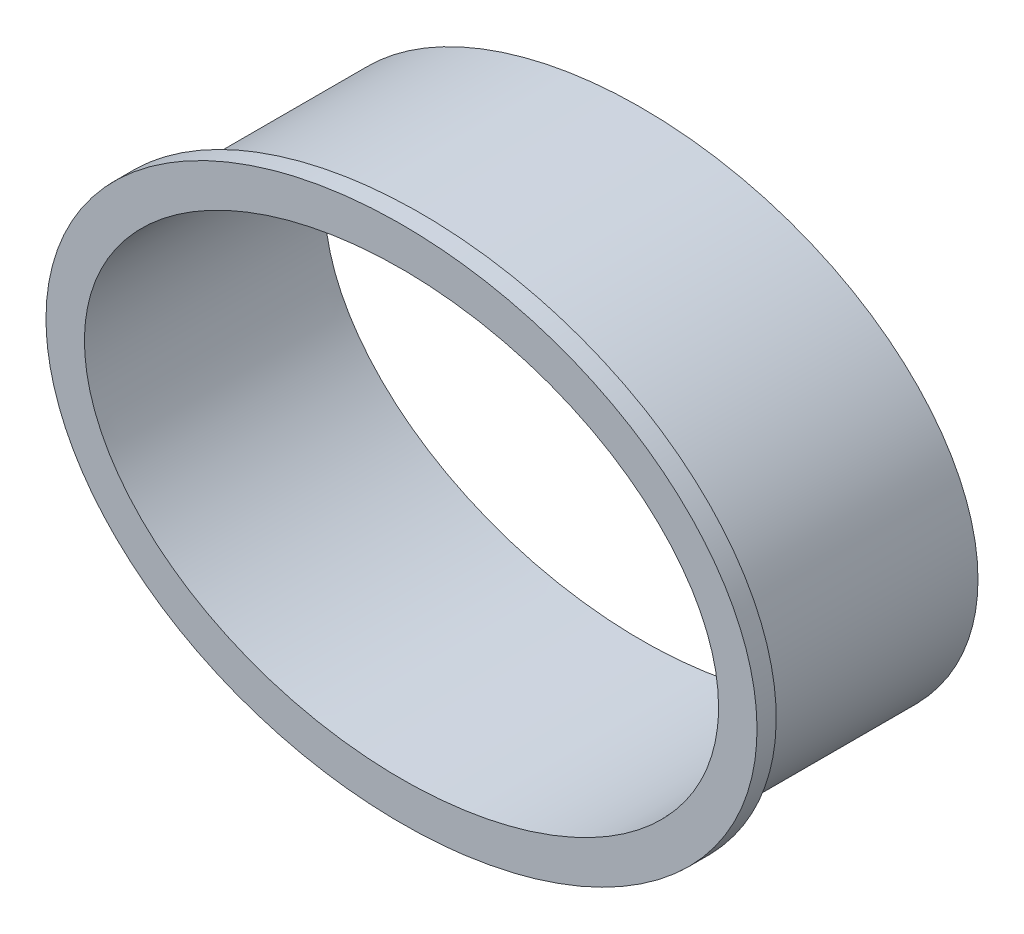
ISO-10303-21;
HEADER;
FILE_DESCRIPTION(('STEP AP214'),'2;1');
FILE_NAME('part.step','',(''),(''),'','','');
FILE_SCHEMA(('AUTOMOTIVE_DESIGN { 1 0 10303 214 1 1 1 1 }'));
ENDSEC;
DATA;
#1=APPLICATION_CONTEXT('core data for automotive mechanical design processes');
#2=APPLICATION_PROTOCOL_DEFINITION('international standard','automotive_design',2000,#1);
#3=PRODUCT_CONTEXT('',#1,'mechanical');
#4=PRODUCT('Part','Part','',(#3));
#5=PRODUCT_RELATED_PRODUCT_CATEGORY('part','',(#4));
#6=PRODUCT_DEFINITION_FORMATION('','',#4);
#7=PRODUCT_DEFINITION_CONTEXT('part definition',#1,'design');
#8=PRODUCT_DEFINITION('design','',#6,#7);
#9=PRODUCT_DEFINITION_SHAPE('','',#8);
#10=(LENGTH_UNIT() NAMED_UNIT(*) SI_UNIT(.MILLI.,.METRE.));
#11=(NAMED_UNIT(*) PLANE_ANGLE_UNIT() SI_UNIT($,.RADIAN.));
#12=(NAMED_UNIT(*) SI_UNIT($,.STERADIAN.) SOLID_ANGLE_UNIT());
#13=UNCERTAINTY_MEASURE_WITH_UNIT(LENGTH_MEASURE(1.E-05),#10,'distance_accuracy_value','');
#14=(GEOMETRIC_REPRESENTATION_CONTEXT(3) GLOBAL_UNCERTAINTY_ASSIGNED_CONTEXT((#13)) GLOBAL_UNIT_ASSIGNED_CONTEXT((#10,
#11,#12)) REPRESENTATION_CONTEXT('',''));
#15=CARTESIAN_POINT('',(0.,0.,0.));
#16=DIRECTION('',(0.,0.,1.));
#17=DIRECTION('',(1.,0.,0.));
#18=AXIS2_PLACEMENT_3D('',#15,#16,#17);
#19=CARTESIAN_POINT('',(0.,0.,25.));
#20=DIRECTION('',(0.,0.,1.));
#21=DIRECTION('',(1.,0.,0.));
#22=AXIS2_PLACEMENT_3D('',#19,#20,#21);
#23=PLANE('',#22);
#24=CARTESIAN_POINT('',(33.,0.,25.));
#25=CARTESIAN_POINT('',(33.,2.91062285011088,25.));
#26=CARTESIAN_POINT('',(31.3999346104749,8.73186855033263,25.));
#27=CARTESIAN_POINT('',(24.2341013569489,16.4552082352201,25.));
#28=CARTESIAN_POINT('',(13.1812256862753,21.7485140322884,25.));
#29=CARTESIAN_POINT('',(0.,23.6257429838558,25.));
#30=CARTESIAN_POINT('',(-13.1812256862753,21.7485140322884,25.));
#31=CARTESIAN_POINT('',(-24.2341013569489,16.4552082352201,25.));
#32=CARTESIAN_POINT('',(-31.3999346104749,8.73186855033263,25.));
#33=CARTESIAN_POINT('',(-33.8000326947625,0.,25.));
#34=CARTESIAN_POINT('',(-31.3999346104749,-8.73186855033263,25.));
#35=CARTESIAN_POINT('',(-24.2341013569489,-16.4552082352201,25.));
#36=CARTESIAN_POINT('',(-13.1812256862753,-21.7485140322884,25.));
#37=CARTESIAN_POINT('',(0.,-23.6257429838558,25.));
#38=CARTESIAN_POINT('',(13.1812256862753,-21.7485140322884,25.));
#39=CARTESIAN_POINT('',(24.2341013569489,-16.4552082352201,25.));
#40=CARTESIAN_POINT('',(31.3999346104749,-8.73186855033264,25.));
#41=CARTESIAN_POINT('',(33.,-2.91062285011089,25.));
#42=CARTESIAN_POINT('',(33.,0.,25.));
#43=B_SPLINE_CURVE_WITH_KNOTS('',3,(#24,#25,#26,#27,#28,#29,#30,#31,#32,#33,#34,#35,#36,#37,#38,
#39,#40,#41,#42),.UNSPECIFIED.,.T.,.F.,(4,1,1,1,1,1,1,1,1,1,1,1,1,1,1,1,4),(0.,
0.392699081698724,0.785398163397448,1.17809724509617,1.5707963267949,1.96349540849362,
2.35619449019234,2.74889357189107,3.14159265358979,3.53429173528852,3.92699081698724,
4.31968989868597,4.71238898038469,5.10508806208341,5.49778714378214,5.89048622548086,
6.28318530717959),.UNSPECIFIED.);
#44=CARTESIAN_POINT('',(33.,0.,25.));
#45=VERTEX_POINT('',#44);
#46=EDGE_CURVE('E53',#45,#45,#43,.T.);
#47=ORIENTED_EDGE('',*,*,#46,.F.);
#48=EDGE_LOOP('',(#47));
#49=FACE_BOUND('',#48,.T.);
#50=CARTESIAN_POINT('',(-37.,0.,25.));
#51=CARTESIAN_POINT('',(-37.,0.534208004363688,25.));
#52=CARTESIAN_POINT('',(-36.978371825077,1.06636015323966,25.));
#53=CARTESIAN_POINT('',(-36.8937045085019,2.1198034820875,25.));
#54=CARTESIAN_POINT('',(-36.830662237015,2.64228191741466,25.));
#55=CARTESIAN_POINT('',(-36.5813648184813,4.19738816709892,25.));
#56=CARTESIAN_POINT('',(-36.33514054876,5.21772820903059,25.));
#57=CARTESIAN_POINT('',(-35.8495344658534,6.72441442252837,25.));
#58=CARTESIAN_POINT('',(-35.6682351806495,7.22266180014688,25.));
#59=CARTESIAN_POINT('',(-35.2668055863474,8.21120001436105,25.));
#60=CARTESIAN_POINT('',(-35.0477618515882,8.6984745586051,25.));
#61=CARTESIAN_POINT('',(-34.3454920481498,10.1254235572445,25.));
#62=CARTESIAN_POINT('',(-33.8147414500529,11.0368238760066,25.));
#63=CARTESIAN_POINT('',(-32.6406883150867,12.7878543519093,25.));
#64=CARTESIAN_POINT('',(-31.9973183861515,13.6274415356501,25.));
#65=CARTESIAN_POINT('',(-30.9531678376952,14.8363859704157,25.));
#66=CARTESIAN_POINT('',(-30.5926850532799,15.2298901525875,25.));
#67=CARTESIAN_POINT('',(-29.8550679142658,15.9917612478385,25.));
#68=CARTESIAN_POINT('',(-29.4769670720748,16.361263564484,25.));
#69=CARTESIAN_POINT('',(-27.5428824785897,18.1551537574857,25.));
#70=CARTESIAN_POINT('',(-25.8578096003217,19.4207101126512,25.));
#71=CARTESIAN_POINT('',(-23.6055525311538,20.8231202523102,25.));
#72=CARTESIAN_POINT('',(-23.1467826427296,21.0949863274686,25.));
#73=CARTESIAN_POINT('',(-22.2235582487253,21.6161641401544,25.));
#74=CARTESIAN_POINT('',(-21.7582775310569,21.8660435287032,25.));
#75=CARTESIAN_POINT('',(-20.3520584708168,22.5853883737476,25.));
#76=CARTESIAN_POINT('',(-19.4007738835733,23.0246500229064,25.));
#77=CARTESIAN_POINT('',(-16.5091893569529,24.2322874927662,25.));
#78=CARTESIAN_POINT('',(-14.5314578152725,24.8913891816313,25.));
#79=CARTESIAN_POINT('',(-11.497260877939,25.6826980304667,25.));
#80=CARTESIAN_POINT('',(-10.4745111046607,25.9133312565843,25.));
#81=CARTESIAN_POINT('',(-8.92362830604622,26.2103590367354,25.));
#82=CARTESIAN_POINT('',(-8.40387026703986,26.3012027007191,25.));
#83=CARTESIAN_POINT('',(-7.35875647551432,26.4665486153687,25.));
#84=CARTESIAN_POINT('',(-6.83311347703773,26.5410525007404,25.));
#85=CARTESIAN_POINT('',(-4.20965990881901,26.870438629738,25.));
#86=CARTESIAN_POINT('',(-2.11141620402273,26.9994359638324,25.));
#87=CARTESIAN_POINT('',(2.0840798102645,27.000560373038,25.));
#88=CARTESIAN_POINT('',(4.18133209491143,26.8726810110651,25.));
#89=CARTESIAN_POINT('',(7.32643435322626,26.4797568766075,25.));
#90=CARTESIAN_POINT('',(8.37651933202895,26.314511520363,25.));
#91=CARTESIAN_POINT('',(10.4493276787632,25.9187685941595,25.));
#92=CARTESIAN_POINT('',(11.4751891448462,25.6880110853729,25.));
#93=CARTESIAN_POINT('',(14.5205160476986,24.8951172063839,25.));
#94=CARTESIAN_POINT('',(16.5080569352589,24.2333980482441,25.));
#95=CARTESIAN_POINT('',(19.4176989395047,23.0172599631808,25.));
#96=CARTESIAN_POINT('',(20.3755614895983,22.5743922821687,25.));
#97=CARTESIAN_POINT('',(22.2647550702488,21.6058967011547,25.));
#98=CARTESIAN_POINT('',(23.187751551996,21.0842828916985,25.));
#99=CARTESIAN_POINT('',(25.8688859190187,19.4117473919819,25.));
#100=CARTESIAN_POINT('',(27.5485766682968,18.15084567168,25.));
#101=CARTESIAN_POINT('',(29.8721903588667,15.9941982829925,25.));
#102=CARTESIAN_POINT('',(30.6172036991141,15.2261281177606,25.));
#103=CARTESIAN_POINT('',(32.001984412415,13.6212757110772,25.));
#104=CARTESIAN_POINT('',(32.6445885415018,12.782732843373,25.));
#105=CARTESIAN_POINT('',(33.5269194667773,11.4657409995195,25.));
#106=CARTESIAN_POINT('',(33.8073983535203,11.0168550099361,25.));
#107=CARTESIAN_POINT('',(34.3394175981567,10.0980900135283,25.));
#108=CARTESIAN_POINT('',(34.5917274831001,9.62652730716563,25.));
#109=CARTESIAN_POINT('',(35.2943178631577,8.19451575631891,25.));
#110=CARTESIAN_POINT('',(35.691789399553,7.21566926396877,25.));
#111=CARTESIAN_POINT('',(36.1763889638387,5.70936063272713,25.));
#112=CARTESIAN_POINT('',(36.3192745457134,5.20090215440884,25.));
#113=CARTESIAN_POINT('',(36.5662365511963,4.17075800220632,25.));
#114=CARTESIAN_POINT('',(36.6705531645955,3.6475110084645,25.));
#115=CARTESIAN_POINT('',(36.920614651694,2.06744768511321,25.));
#116=CARTESIAN_POINT('',(37.0018536611945,1.01530848301199,25.));
#117=CARTESIAN_POINT('',(36.9980824134517,-1.0865650422981,25.));
#118=CARTESIAN_POINT('',(36.9130643945453,-2.13629925323065,25.));
#119=CARTESIAN_POINT('',(36.6589797662201,-3.70906985057264,25.));
#120=CARTESIAN_POINT('',(36.5526157774389,-4.23443865281458,25.));
#121=CARTESIAN_POINT('',(36.3017948631361,-5.26603570853028,25.));
#122=CARTESIAN_POINT('',(36.1571096973246,-5.77442898087401,25.));
#123=CARTESIAN_POINT('',(35.6679479974542,-7.27843724524308,25.));
#124=CARTESIAN_POINT('',(35.2685557634005,-8.2529538747786,25.));
#125=CARTESIAN_POINT('',(34.3322399880069,-10.1491482303105,25.));
#126=CARTESIAN_POINT('',(33.791271403953,-11.0754506114809,25.));
#127=CARTESIAN_POINT('',(32.0193192254213,-13.7070887545725,25.));
#128=CARTESIAN_POINT('',(30.6335153149815,-15.2900925966419,25.));
#129=CARTESIAN_POINT('',(28.6894518415622,-17.0913015442211,25.));
#130=CARTESIAN_POINT('',(28.2888907924727,-17.4433041505494,25.));
#131=CARTESIAN_POINT('',(27.4748710724303,-18.123211898336,25.));
#132=CARTESIAN_POINT('',(27.0608075070507,-18.4517692501558,25.));
#133=CARTESIAN_POINT('',(25.7987689899553,-19.4053736024503,25.));
#134=CARTESIAN_POINT('',(24.9310116657235,-19.9984586434173,25.));
#135=CARTESIAN_POINT('',(23.1477597753376,-21.1075006765235,25.));
#136=CARTESIAN_POINT('',(22.2322434834826,-21.6234225669087,25.));
#137=CARTESIAN_POINT('',(20.8255252288674,-22.3432709372811,25.));
#138=CARTESIAN_POINT('',(20.351032648151,-22.5741944112767,25.));
#139=CARTESIAN_POINT('',(19.3911387314574,-23.018416314868,25.));
#140=CARTESIAN_POINT('',(18.9047295155853,-23.2321244516239,25.));
#141=CARTESIAN_POINT('',(16.4593603784222,-24.2518353745391,25.));
#142=CARTESIAN_POINT('',(14.4679275851152,-24.9108815339509,25.));
#143=CARTESIAN_POINT('',(10.42462792916,-25.9594217324227,25.));
#144=CARTESIAN_POINT('',(8.37265859965154,-26.3484587418681,25.));
#145=CARTESIAN_POINT('',(5.25149241428167,-26.7392763208798,25.));
#146=CARTESIAN_POINT('',(4.20385839977855,-26.8372329327392,25.));
#147=CARTESIAN_POINT('',(2.09398093474011,-26.9679841625274,25.));
#148=CARTESIAN_POINT('',(1.03426736361752,-27.000395928132,25.));
#149=CARTESIAN_POINT('',(-2.1265620828558,-26.9991971398987,25.));
#150=CARTESIAN_POINT('',(-4.22189821021005,-26.8687653587702,25.));
#151=CARTESIAN_POINT('',(-7.34688877559995,-26.4766139452693,25.));
#152=CARTESIAN_POINT('',(-8.38553407117109,-26.312972133706,25.));
#153=CARTESIAN_POINT('',(-10.4565469304869,-25.9172071388374,25.));
#154=CARTESIAN_POINT('',(-11.4923673832261,-25.6841211571052,25.));
#155=CARTESIAN_POINT('',(-14.5595875440856,-24.8837578788096,25.));
#156=CARTESIAN_POINT('',(-16.5500042550187,-24.2178177782963,25.));
#157=CARTESIAN_POINT('',(-20.4130238507727,-22.5992589863123,25.));
#158=CARTESIAN_POINT('',(-22.2859283175432,-21.6473741398514,25.));
#159=CARTESIAN_POINT('',(-25.8897849441895,-19.3981892383195,25.));
#160=CARTESIAN_POINT('',(-27.5725307891046,-18.1303766451533,25.));
#161=CARTESIAN_POINT('',(-29.8807472770785,-15.9853624971174,25.));
#162=CARTESIAN_POINT('',(-30.6143452730733,-15.2292301339677,25.));
#163=CARTESIAN_POINT('',(-31.653741168284,-14.0249671707285,25.));
#164=CARTESIAN_POINT('',(-31.9907358273889,-13.6107525762248,25.));
#165=CARTESIAN_POINT('',(-32.6351602031332,-12.7671876840169,25.));
#166=CARTESIAN_POINT('',(-32.9434330027451,-12.3369745304779,25.));
#167=CARTESIAN_POINT('',(-33.8250113983239,-11.0201830027722,25.));
#168=CARTESIAN_POINT('',(-34.3552764087928,-10.1075731717444,25.));
#169=CARTESIAN_POINT('',(-35.0557320144158,-8.68123643133327,25.));
#170=CARTESIAN_POINT('',(-35.2739351013321,-8.19471348913341,25.));
#171=CARTESIAN_POINT('',(-35.673750679779,-7.20797505965257,25.));
#172=CARTESIAN_POINT('',(-35.85431647569,-6.71065450515272,25.));
#173=CARTESIAN_POINT('',(-36.6603643230805,-4.20428049556793,25.));
#174=CARTESIAN_POINT('',(-37.,-2.13683201745475,25.));
#175=CARTESIAN_POINT('',(-37.,0.,25.));
#176=B_SPLINE_CURVE_WITH_KNOTS('',3,(#50,#51,#52,#53,#54,#55,#56,#57,#58,#59,#60,#61,#62,#63,
#64,#65,#66,#67,#68,#69,#70,#71,#72,#73,#74,#75,#76,#77,#78,#79,#80,#81,#82,#83,#84,#85,#86,#87,
#88,#89,#90,#91,#92,#93,#94,#95,#96,#97,#98,#99,#100,#101,#102,#103,#104,#105,#106,#107,#108,
#109,#110,#111,#112,#113,#114,#115,#116,#117,#118,#119,#120,#121,#122,#123,#124,#125,#126,#127,
#128,#129,#130,#131,#132,#133,#134,#135,#136,#137,#138,#139,#140,#141,#142,#143,#144,#145,#146,
#147,#148,#149,#150,#151,#152,#153,#154,#155,#156,#157,#158,#159,#160,#161,#162,#163,#164,#165,
#166,#167,#168,#169,#170,#171,#172,#173,#174,#175),.UNSPECIFIED.,.T.,.F.,(4,2,2,2,2,2,2,2,2,2,2,
2,2,2,2,2,2,2,2,2,2,2,2,2,2,2,2,2,2,2,2,2,2,2,2,2,2,2,2,2,2,2,2,2,2,2,2,2,2,2,2,2,2,2,2,2,2,2,2,
2,2,2,4),(0.,0.00781249999999989,0.0156249999999998,0.0312499999999998,0.0390624999999997,
0.0468749999999997,0.0624999999999996,0.0781249999999994,0.0859374999999994,0.0937499999999994,
0.124999999999999,0.132812499999999,0.140624999999999,0.156249999999999,0.187499999999999,
0.203124999999999,0.210937499999999,0.218749999999999,0.249999999999999,0.281249999999999,
0.296874999999999,0.312499999999999,0.343749999999999,0.359374999999999,0.374999999999999,
0.406249999999999,0.421874999999999,0.437499999999999,0.445312499999999,0.453124999999999,
0.468749999999999,0.476562499999999,0.484374999999999,0.499999999999999,0.515624999999999,
0.523437499999999,0.531249999999999,0.546874999999999,0.562499999999999,0.593749999999999,
0.601562499999999,0.609374999999999,0.624999999999999,0.640624999999999,0.648437499999999,
0.656249999999999,0.687499999999999,0.718749999999999,0.734374999999999,0.749999999999999,
0.78125,0.796875,0.8125,0.84375,0.875,0.90625,0.921875,0.9296875,0.9375,0.953125,0.9609375,
0.96875,1.),.UNSPECIFIED.);
#177=CARTESIAN_POINT('',(-37.,0.,25.));
#178=VERTEX_POINT('',#177);
#179=EDGE_CURVE('E66',#178,#178,#176,.F.);
#180=ORIENTED_EDGE('',*,*,#179,.T.);
#181=EDGE_LOOP('',(#180));
#182=FACE_BOUND('',#181,.T.);
#183=ADVANCED_FACE('F41',(#49,#182),#23,.T.);
#184=CARTESIAN_POINT('',(0.,0.,0.));
#185=DIRECTION('',(0.,0.,1.));
#186=DIRECTION('',(1.,0.,0.));
#187=AXIS2_PLACEMENT_3D('',#184,#185,#186);
#188=PLANE('',#187);
#189=CARTESIAN_POINT('',(0.,0.,0.));
#190=DIRECTION('',(0.,0.,1.));
#191=DIRECTION('',(1.,0.,0.));
#192=AXIS2_PLACEMENT_3D('',#189,#190,#191);
#193=ELLIPSE('',#192,35.,25.);
#194=CARTESIAN_POINT('',(35.,0.,0.));
#195=VERTEX_POINT('',#194);
#196=EDGE_CURVE('E10',#195,#195,#193,.T.);
#197=ORIENTED_EDGE('',*,*,#196,.F.);
#198=EDGE_LOOP('',(#197));
#199=FACE_BOUND('',#198,.T.);
#200=CARTESIAN_POINT('',(33.,0.,0.));
#201=CARTESIAN_POINT('',(33.,2.91062285011088,0.));
#202=CARTESIAN_POINT('',(31.3999346104749,8.73186855033263,0.));
#203=CARTESIAN_POINT('',(24.2341013569489,16.4552082352201,0.));
#204=CARTESIAN_POINT('',(13.1812256862753,21.7485140322884,0.));
#205=CARTESIAN_POINT('',(0.,23.6257429838558,0.));
#206=CARTESIAN_POINT('',(-13.1812256862753,21.7485140322884,0.));
#207=CARTESIAN_POINT('',(-24.2341013569489,16.4552082352201,0.));
#208=CARTESIAN_POINT('',(-31.3999346104749,8.73186855033263,0.));
#209=CARTESIAN_POINT('',(-33.8000326947625,0.,0.));
#210=CARTESIAN_POINT('',(-31.3999346104749,-8.73186855033263,0.));
#211=CARTESIAN_POINT('',(-24.2341013569489,-16.4552082352201,0.));
#212=CARTESIAN_POINT('',(-13.1812256862753,-21.7485140322884,0.));
#213=CARTESIAN_POINT('',(0.,-23.6257429838558,0.));
#214=CARTESIAN_POINT('',(13.1812256862753,-21.7485140322884,0.));
#215=CARTESIAN_POINT('',(24.2341013569489,-16.4552082352201,0.));
#216=CARTESIAN_POINT('',(31.3999346104749,-8.73186855033264,0.));
#217=CARTESIAN_POINT('',(33.,-2.91062285011089,0.));
#218=CARTESIAN_POINT('',(33.,0.,0.));
#219=B_SPLINE_CURVE_WITH_KNOTS('',3,(#200,#201,#202,#203,#204,#205,#206,#207,#208,#209,#210,
#211,#212,#213,#214,#215,#216,#217,#218),.UNSPECIFIED.,.T.,.F.,(4,1,1,1,1,1,1,1,1,1,1,1,1,1,1,1,
4),(0.,0.392699081698724,0.785398163397448,1.17809724509617,1.5707963267949,1.96349540849362,
2.35619449019234,2.74889357189107,3.14159265358979,3.53429173528852,3.92699081698724,
4.31968989868597,4.71238898038469,5.10508806208341,5.49778714378214,5.89048622548086,
6.28318530717959),.UNSPECIFIED.);
#220=CARTESIAN_POINT('',(33.,0.,0.));
#221=VERTEX_POINT('',#220);
#222=EDGE_CURVE('E59',#221,#221,#219,.T.);
#223=ORIENTED_EDGE('',*,*,#222,.T.);
#224=EDGE_LOOP('',(#223));
#225=FACE_BOUND('',#224,.T.);
#226=ADVANCED_FACE('F107',(#199,#225),#188,.F.);
#227=CARTESIAN_POINT('',(0.,0.,25.));
#228=DIRECTION('',(0.,0.,1.));
#229=DIRECTION('',(1.,0.,0.));
#230=AXIS2_PLACEMENT_3D('',#227,#228,#229);
#231=ELLIPSE('',#230,35.,25.);
#232=DIRECTION('',(0.,0.,-1.));
#233=VECTOR('',#232,1.);
#234=SURFACE_OF_LINEAR_EXTRUSION('',#231,#233);
#235=CARTESIAN_POINT('',(0.,0.,23.));
#236=DIRECTION('',(0.,0.,1.));
#237=DIRECTION('',(1.,0.,0.));
#238=AXIS2_PLACEMENT_3D('',#235,#236,#237);
#239=ELLIPSE('',#238,35.,25.);
#240=CARTESIAN_POINT('',(35.,0.,23.));
#241=VERTEX_POINT('',#240);
#242=EDGE_CURVE('E73',#241,#241,#239,.F.);
#243=ORIENTED_EDGE('',*,*,#242,.T.);
#244=EDGE_LOOP('',(#243));
#245=FACE_BOUND('',#244,.T.);
#246=ORIENTED_EDGE('',*,*,#196,.T.);
#247=EDGE_LOOP('',(#246));
#248=FACE_BOUND('',#247,.T.);
#249=ADVANCED_FACE('F43',(#245,#248),#234,.F.);
#250=DIRECTION('',(0.,0.,-1.));
#251=VECTOR('',#250,1.);
#252=SURFACE_OF_LINEAR_EXTRUSION('',#43,#251);
#253=ORIENTED_EDGE('',*,*,#222,.F.);
#254=EDGE_LOOP('',(#253));
#255=FACE_BOUND('',#254,.T.);
#256=ORIENTED_EDGE('',*,*,#46,.T.);
#257=EDGE_LOOP('',(#256));
#258=FACE_BOUND('',#257,.T.);
#259=ADVANCED_FACE('F97',(#255,#258),#252,.T.);
#260=CARTESIAN_POINT('',(36.9999680373231,-0.0356282796432738,23.));
#261=DIRECTION('',(0.,0.,-1.));
#262=DIRECTION('',(-1.,0.,0.));
#263=AXIS2_PLACEMENT_3D('',#260,#261,#262);
#264=PLANE('',#263);
#265=CARTESIAN_POINT('',(-37.,0.,23.));
#266=CARTESIAN_POINT('',(-37.,-2.13683201745475,23.));
#267=CARTESIAN_POINT('',(-36.6603643230805,-4.20428049556793,23.));
#268=CARTESIAN_POINT('',(-35.85431647569,-6.71065450515272,23.));
#269=CARTESIAN_POINT('',(-35.673750679779,-7.20797505965257,23.));
#270=CARTESIAN_POINT('',(-35.2739351013321,-8.19471348913341,23.));
#271=CARTESIAN_POINT('',(-35.0557320144158,-8.68123643133327,23.));
#272=CARTESIAN_POINT('',(-34.3552764087928,-10.1075731717444,23.));
#273=CARTESIAN_POINT('',(-33.8250113983239,-11.0201830027722,23.));
#274=CARTESIAN_POINT('',(-32.9434330027451,-12.3369745304779,23.));
#275=CARTESIAN_POINT('',(-32.6351602031332,-12.7671876840169,23.));
#276=CARTESIAN_POINT('',(-31.9907358273889,-13.6107525762248,23.));
#277=CARTESIAN_POINT('',(-31.653741168284,-14.0249671707285,23.));
#278=CARTESIAN_POINT('',(-30.6143452730733,-15.2292301339677,23.));
#279=CARTESIAN_POINT('',(-29.8807472770785,-15.9853624971174,23.));
#280=CARTESIAN_POINT('',(-27.5725307891046,-18.1303766451533,23.));
#281=CARTESIAN_POINT('',(-25.8897849441895,-19.3981892383195,23.));
#282=CARTESIAN_POINT('',(-22.2859283175432,-21.6473741398514,23.));
#283=CARTESIAN_POINT('',(-20.4130238507727,-22.5992589863123,23.));
#284=CARTESIAN_POINT('',(-16.5500042550187,-24.2178177782963,23.));
#285=CARTESIAN_POINT('',(-14.5595875440856,-24.8837578788096,23.));
#286=CARTESIAN_POINT('',(-11.4923673832261,-25.6841211571052,23.));
#287=CARTESIAN_POINT('',(-10.4565469304869,-25.9172071388374,23.));
#288=CARTESIAN_POINT('',(-8.38553407117109,-26.312972133706,23.));
#289=CARTESIAN_POINT('',(-7.34688877559995,-26.4766139452693,23.));
#290=CARTESIAN_POINT('',(-4.22189821021005,-26.8687653587702,23.));
#291=CARTESIAN_POINT('',(-2.1265620828558,-26.9991971398987,23.));
#292=CARTESIAN_POINT('',(1.03426736361752,-27.000395928132,23.));
#293=CARTESIAN_POINT('',(2.09398093474011,-26.9679841625274,23.));
#294=CARTESIAN_POINT('',(4.20385839977855,-26.8372329327392,23.));
#295=CARTESIAN_POINT('',(5.25149241428167,-26.7392763208798,23.));
#296=CARTESIAN_POINT('',(8.37265859965154,-26.3484587418681,23.));
#297=CARTESIAN_POINT('',(10.42462792916,-25.9594217324227,23.));
#298=CARTESIAN_POINT('',(14.4679275851152,-24.9108815339509,23.));
#299=CARTESIAN_POINT('',(16.4593603784222,-24.2518353745391,23.));
#300=CARTESIAN_POINT('',(18.9047295155853,-23.2321244516239,23.));
#301=CARTESIAN_POINT('',(19.3911387314574,-23.018416314868,23.));
#302=CARTESIAN_POINT('',(20.351032648151,-22.5741944112767,23.));
#303=CARTESIAN_POINT('',(20.8255252288674,-22.3432709372811,23.));
#304=CARTESIAN_POINT('',(22.2322434834826,-21.6234225669087,23.));
#305=CARTESIAN_POINT('',(23.1477597753376,-21.1075006765235,23.));
#306=CARTESIAN_POINT('',(24.9310116657235,-19.9984586434173,23.));
#307=CARTESIAN_POINT('',(25.7987689899553,-19.4053736024503,23.));
#308=CARTESIAN_POINT('',(27.0608075070507,-18.4517692501558,23.));
#309=CARTESIAN_POINT('',(27.4748710724303,-18.123211898336,23.));
#310=CARTESIAN_POINT('',(28.2888907924727,-17.4433041505494,23.));
#311=CARTESIAN_POINT('',(28.6894518415622,-17.0913015442211,23.));
#312=CARTESIAN_POINT('',(30.6335153149815,-15.2900925966419,23.));
#313=CARTESIAN_POINT('',(32.0193192254213,-13.7070887545725,23.));
#314=CARTESIAN_POINT('',(33.791271403953,-11.0754506114809,23.));
#315=CARTESIAN_POINT('',(34.3322399880069,-10.1491482303105,23.));
#316=CARTESIAN_POINT('',(35.2685557634005,-8.2529538747786,23.));
#317=CARTESIAN_POINT('',(35.6679479974542,-7.27843724524308,23.));
#318=CARTESIAN_POINT('',(36.1571096973246,-5.77442898087401,23.));
#319=CARTESIAN_POINT('',(36.3017948631361,-5.26603570853028,23.));
#320=CARTESIAN_POINT('',(36.5526157774389,-4.23443865281458,23.));
#321=CARTESIAN_POINT('',(36.6589797662201,-3.70906985057264,23.));
#322=CARTESIAN_POINT('',(36.9130643945453,-2.13629925323065,23.));
#323=CARTESIAN_POINT('',(36.9980824134517,-1.0865650422981,23.));
#324=CARTESIAN_POINT('',(37.0018536611945,1.01530848301199,23.));
#325=CARTESIAN_POINT('',(36.920614651694,2.06744768511321,23.));
#326=CARTESIAN_POINT('',(36.6705531645955,3.6475110084645,23.));
#327=CARTESIAN_POINT('',(36.5662365511963,4.17075800220632,23.));
#328=CARTESIAN_POINT('',(36.3192745457134,5.20090215440884,23.));
#329=CARTESIAN_POINT('',(36.1763889638387,5.70936063272713,23.));
#330=CARTESIAN_POINT('',(35.691789399553,7.21566926396877,23.));
#331=CARTESIAN_POINT('',(35.2943178631577,8.19451575631891,23.));
#332=CARTESIAN_POINT('',(34.5917274831001,9.62652730716563,23.));
#333=CARTESIAN_POINT('',(34.3394175981567,10.0980900135283,23.));
#334=CARTESIAN_POINT('',(33.8073983535203,11.0168550099361,23.));
#335=CARTESIAN_POINT('',(33.5269194667773,11.4657409995195,23.));
#336=CARTESIAN_POINT('',(32.6445885415018,12.782732843373,23.));
#337=CARTESIAN_POINT('',(32.001984412415,13.6212757110772,23.));
#338=CARTESIAN_POINT('',(30.6172036991141,15.2261281177606,23.));
#339=CARTESIAN_POINT('',(29.8721903588667,15.9941982829925,23.));
#340=CARTESIAN_POINT('',(27.5485766682968,18.15084567168,23.));
#341=CARTESIAN_POINT('',(25.8688859190187,19.4117473919819,23.));
#342=CARTESIAN_POINT('',(23.187751551996,21.0842828916985,23.));
#343=CARTESIAN_POINT('',(22.2647550702488,21.6058967011547,23.));
#344=CARTESIAN_POINT('',(20.3755614895983,22.5743922821687,23.));
#345=CARTESIAN_POINT('',(19.4176989395047,23.0172599631808,23.));
#346=CARTESIAN_POINT('',(16.5080569352589,24.2333980482441,23.));
#347=CARTESIAN_POINT('',(14.5205160476986,24.8951172063839,23.));
#348=CARTESIAN_POINT('',(11.4751891448462,25.6880110853729,23.));
#349=CARTESIAN_POINT('',(10.4493276787632,25.9187685941595,23.));
#350=CARTESIAN_POINT('',(8.37651933202895,26.314511520363,23.));
#351=CARTESIAN_POINT('',(7.32643435322626,26.4797568766075,23.));
#352=CARTESIAN_POINT('',(4.18133209491143,26.8726810110651,23.));
#353=CARTESIAN_POINT('',(2.0840798102645,27.000560373038,23.));
#354=CARTESIAN_POINT('',(-2.11141620402273,26.9994359638324,23.));
#355=CARTESIAN_POINT('',(-4.20965990881901,26.870438629738,23.));
#356=CARTESIAN_POINT('',(-6.83311347703773,26.5410525007404,23.));
#357=CARTESIAN_POINT('',(-7.35875647551432,26.4665486153687,23.));
#358=CARTESIAN_POINT('',(-8.40387026703986,26.3012027007191,23.));
#359=CARTESIAN_POINT('',(-8.92362830604622,26.2103590367354,23.));
#360=CARTESIAN_POINT('',(-10.4745111046607,25.9133312565843,23.));
#361=CARTESIAN_POINT('',(-11.497260877939,25.6826980304667,23.));
#362=CARTESIAN_POINT('',(-14.5314578152725,24.8913891816313,23.));
#363=CARTESIAN_POINT('',(-16.5091893569529,24.2322874927662,23.));
#364=CARTESIAN_POINT('',(-19.4007738835733,23.0246500229064,23.));
#365=CARTESIAN_POINT('',(-20.3520584708168,22.5853883737476,23.));
#366=CARTESIAN_POINT('',(-21.7582775310569,21.8660435287032,23.));
#367=CARTESIAN_POINT('',(-22.2235582487253,21.6161641401544,23.));
#368=CARTESIAN_POINT('',(-23.1467826427296,21.0949863274686,23.));
#369=CARTESIAN_POINT('',(-23.6055525311538,20.8231202523102,23.));
#370=CARTESIAN_POINT('',(-25.8578096003217,19.4207101126512,23.));
#371=CARTESIAN_POINT('',(-27.5428824785897,18.1551537574857,23.));
#372=CARTESIAN_POINT('',(-29.4769670720748,16.361263564484,23.));
#373=CARTESIAN_POINT('',(-29.8550679142658,15.9917612478385,23.));
#374=CARTESIAN_POINT('',(-30.5926850532799,15.2298901525875,23.));
#375=CARTESIAN_POINT('',(-30.9531678376952,14.8363859704157,23.));
#376=CARTESIAN_POINT('',(-31.9973183861515,13.6274415356501,23.));
#377=CARTESIAN_POINT('',(-32.6406883150867,12.7878543519093,23.));
#378=CARTESIAN_POINT('',(-33.8147414500529,11.0368238760066,23.));
#379=CARTESIAN_POINT('',(-34.3454920481498,10.1254235572445,23.));
#380=CARTESIAN_POINT('',(-35.0477618515882,8.6984745586051,23.));
#381=CARTESIAN_POINT('',(-35.2668055863474,8.21120001436105,23.));
#382=CARTESIAN_POINT('',(-35.6682351806495,7.22266180014688,23.));
#383=CARTESIAN_POINT('',(-35.8495344658534,6.72441442252837,23.));
#384=CARTESIAN_POINT('',(-36.33514054876,5.21772820903059,23.));
#385=CARTESIAN_POINT('',(-36.5813648184813,4.19738816709892,23.));
#386=CARTESIAN_POINT('',(-36.830662237015,2.64228191741466,23.));
#387=CARTESIAN_POINT('',(-36.8937045085019,2.1198034820875,23.));
#388=CARTESIAN_POINT('',(-36.978371825077,1.06636015323966,23.));
#389=CARTESIAN_POINT('',(-37.,0.534208004363688,23.));
#390=CARTESIAN_POINT('',(-37.,0.,23.));
#391=B_SPLINE_CURVE_WITH_KNOTS('',3,(#265,#266,#267,#268,#269,#270,#271,#272,#273,#274,#275,
#276,#277,#278,#279,#280,#281,#282,#283,#284,#285,#286,#287,#288,#289,#290,#291,#292,#293,#294,
#295,#296,#297,#298,#299,#300,#301,#302,#303,#304,#305,#306,#307,#308,#309,#310,#311,#312,#313,
#314,#315,#316,#317,#318,#319,#320,#321,#322,#323,#324,#325,#326,#327,#328,#329,#330,#331,#332,
#333,#334,#335,#336,#337,#338,#339,#340,#341,#342,#343,#344,#345,#346,#347,#348,#349,#350,#351,
#352,#353,#354,#355,#356,#357,#358,#359,#360,#361,#362,#363,#364,#365,#366,#367,#368,#369,#370,
#371,#372,#373,#374,#375,#376,#377,#378,#379,#380,#381,#382,#383,#384,#385,#386,#387,#388,#389,
#390),.UNSPECIFIED.,.T.,.F.,(4,2,2,2,2,2,2,2,2,2,2,2,2,2,2,2,2,2,2,2,2,2,2,2,2,2,2,2,2,2,2,2,2,
2,2,2,2,2,2,2,2,2,2,2,2,2,2,2,2,2,2,2,2,2,2,2,2,2,2,2,2,2,4),(0.,0.0312499999999998,
0.0390624999999998,0.0468749999999998,0.0624999999999998,0.0703124999999998,0.0781249999999998,
0.0937499999999999,0.125,0.15625,0.1875,0.203125,0.21875,0.250000000000001,0.265625000000001,
0.281250000000001,0.312500000000001,0.343750000000001,0.351562500000001,0.359375000000001,
0.375000000000001,0.390625000000001,0.398437500000001,0.406250000000001,0.437500000000001,
0.453125000000001,0.468750000000001,0.476562500000001,0.484375000000001,0.500000000000001,
0.515625000000001,0.523437500000001,0.531250000000001,0.546875000000001,0.554687500000001,
0.562500000000001,0.578125000000001,0.593750000000001,0.625000000000001,0.640625000000001,
0.656250000000001,0.687500000000001,0.703125000000001,0.718750000000001,0.750000000000001,
0.781250000000001,0.789062500000001,0.796875000000001,0.812500000000001,0.843750000000001,
0.859375000000001,0.867187500000001,0.875000000000001,0.906250000000001,0.914062500000001,
0.921875000000001,0.9375,0.953125,0.9609375,0.96875,0.984375,0.9921875,1.),.UNSPECIFIED.);
#392=CARTESIAN_POINT('',(-37.,0.,23.));
#393=VERTEX_POINT('',#392);
#394=EDGE_CURVE('E70',#393,#393,#391,.T.);
#395=ORIENTED_EDGE('',*,*,#394,.F.);
#396=EDGE_LOOP('',(#395));
#397=FACE_BOUND('',#396,.T.);
#398=ORIENTED_EDGE('',*,*,#242,.F.);
#399=EDGE_LOOP('',(#398));
#400=FACE_BOUND('',#399,.T.);
#401=ADVANCED_FACE('F99',(#397,#400),#264,.T.);
#402=CARTESIAN_POINT('',(-37.,0.,23.));
#403=CARTESIAN_POINT('',(-37.,-2.13683201745475,23.));
#404=CARTESIAN_POINT('',(-36.6603643230805,-4.20428049556793,23.));
#405=CARTESIAN_POINT('',(-35.85431647569,-6.71065450515272,23.));
#406=CARTESIAN_POINT('',(-35.673750679779,-7.20797505965257,23.));
#407=CARTESIAN_POINT('',(-35.2739351013321,-8.19471348913341,23.));
#408=CARTESIAN_POINT('',(-35.0557320144158,-8.68123643133327,23.));
#409=CARTESIAN_POINT('',(-34.3552764087928,-10.1075731717444,23.));
#410=CARTESIAN_POINT('',(-33.8250113983239,-11.0201830027722,23.));
#411=CARTESIAN_POINT('',(-32.9434330027451,-12.3369745304779,23.));
#412=CARTESIAN_POINT('',(-32.6351602031332,-12.7671876840169,23.));
#413=CARTESIAN_POINT('',(-31.9907358273889,-13.6107525762248,23.));
#414=CARTESIAN_POINT('',(-31.653741168284,-14.0249671707285,23.));
#415=CARTESIAN_POINT('',(-30.6143452730733,-15.2292301339677,23.));
#416=CARTESIAN_POINT('',(-29.8807472770785,-15.9853624971174,23.));
#417=CARTESIAN_POINT('',(-27.5725307891046,-18.1303766451533,23.));
#418=CARTESIAN_POINT('',(-25.8897849441895,-19.3981892383195,23.));
#419=CARTESIAN_POINT('',(-22.2859283175432,-21.6473741398514,23.));
#420=CARTESIAN_POINT('',(-20.4130238507727,-22.5992589863123,23.));
#421=CARTESIAN_POINT('',(-16.5500042550187,-24.2178177782963,23.));
#422=CARTESIAN_POINT('',(-14.5595875440856,-24.8837578788096,23.));
#423=CARTESIAN_POINT('',(-11.4923673832261,-25.6841211571052,23.));
#424=CARTESIAN_POINT('',(-10.4565469304869,-25.9172071388374,23.));
#425=CARTESIAN_POINT('',(-8.38553407117109,-26.312972133706,23.));
#426=CARTESIAN_POINT('',(-7.34688877559995,-26.4766139452693,23.));
#427=CARTESIAN_POINT('',(-4.22189821021005,-26.8687653587702,23.));
#428=CARTESIAN_POINT('',(-2.1265620828558,-26.9991971398987,23.));
#429=CARTESIAN_POINT('',(1.03426736361752,-27.000395928132,23.));
#430=CARTESIAN_POINT('',(2.09398093474011,-26.9679841625274,23.));
#431=CARTESIAN_POINT('',(4.20385839977855,-26.8372329327392,23.));
#432=CARTESIAN_POINT('',(5.25149241428167,-26.7392763208798,23.));
#433=CARTESIAN_POINT('',(8.37265859965154,-26.3484587418681,23.));
#434=CARTESIAN_POINT('',(10.42462792916,-25.9594217324227,23.));
#435=CARTESIAN_POINT('',(14.4679275851152,-24.9108815339509,23.));
#436=CARTESIAN_POINT('',(16.4593603784222,-24.2518353745391,23.));
#437=CARTESIAN_POINT('',(18.9047295155853,-23.2321244516239,23.));
#438=CARTESIAN_POINT('',(19.3911387314574,-23.018416314868,23.));
#439=CARTESIAN_POINT('',(20.351032648151,-22.5741944112767,23.));
#440=CARTESIAN_POINT('',(20.8255252288674,-22.3432709372811,23.));
#441=CARTESIAN_POINT('',(22.2322434834826,-21.6234225669087,23.));
#442=CARTESIAN_POINT('',(23.1477597753376,-21.1075006765235,23.));
#443=CARTESIAN_POINT('',(24.9310116657235,-19.9984586434173,23.));
#444=CARTESIAN_POINT('',(25.7987689899553,-19.4053736024503,23.));
#445=CARTESIAN_POINT('',(27.0608075070507,-18.4517692501558,23.));
#446=CARTESIAN_POINT('',(27.4748710724303,-18.123211898336,23.));
#447=CARTESIAN_POINT('',(28.2888907924727,-17.4433041505494,23.));
#448=CARTESIAN_POINT('',(28.6894518415622,-17.0913015442211,23.));
#449=CARTESIAN_POINT('',(30.6335153149815,-15.2900925966419,23.));
#450=CARTESIAN_POINT('',(32.0193192254213,-13.7070887545725,23.));
#451=CARTESIAN_POINT('',(33.791271403953,-11.0754506114809,23.));
#452=CARTESIAN_POINT('',(34.3322399880069,-10.1491482303105,23.));
#453=CARTESIAN_POINT('',(35.2685557634005,-8.2529538747786,23.));
#454=CARTESIAN_POINT('',(35.6679479974542,-7.27843724524308,23.));
#455=CARTESIAN_POINT('',(36.1571096973246,-5.77442898087401,23.));
#456=CARTESIAN_POINT('',(36.3017948631361,-5.26603570853028,23.));
#457=CARTESIAN_POINT('',(36.5526157774389,-4.23443865281458,23.));
#458=CARTESIAN_POINT('',(36.6589797662201,-3.70906985057264,23.));
#459=CARTESIAN_POINT('',(36.9130643945453,-2.13629925323065,23.));
#460=CARTESIAN_POINT('',(36.9980824134517,-1.0865650422981,23.));
#461=CARTESIAN_POINT('',(37.0018536611945,1.01530848301199,23.));
#462=CARTESIAN_POINT('',(36.920614651694,2.06744768511321,23.));
#463=CARTESIAN_POINT('',(36.6705531645955,3.6475110084645,23.));
#464=CARTESIAN_POINT('',(36.5662365511963,4.17075800220632,23.));
#465=CARTESIAN_POINT('',(36.3192745457134,5.20090215440884,23.));
#466=CARTESIAN_POINT('',(36.1763889638387,5.70936063272713,23.));
#467=CARTESIAN_POINT('',(35.691789399553,7.21566926396877,23.));
#468=CARTESIAN_POINT('',(35.2943178631577,8.19451575631891,23.));
#469=CARTESIAN_POINT('',(34.5917274831001,9.62652730716563,23.));
#470=CARTESIAN_POINT('',(34.3394175981567,10.0980900135283,23.));
#471=CARTESIAN_POINT('',(33.8073983535203,11.0168550099361,23.));
#472=CARTESIAN_POINT('',(33.5269194667773,11.4657409995195,23.));
#473=CARTESIAN_POINT('',(32.6445885415018,12.782732843373,23.));
#474=CARTESIAN_POINT('',(32.001984412415,13.6212757110772,23.));
#475=CARTESIAN_POINT('',(30.6172036991141,15.2261281177606,23.));
#476=CARTESIAN_POINT('',(29.8721903588667,15.9941982829925,23.));
#477=CARTESIAN_POINT('',(27.5485766682968,18.15084567168,23.));
#478=CARTESIAN_POINT('',(25.8688859190187,19.4117473919819,23.));
#479=CARTESIAN_POINT('',(23.187751551996,21.0842828916985,23.));
#480=CARTESIAN_POINT('',(22.2647550702488,21.6058967011547,23.));
#481=CARTESIAN_POINT('',(20.3755614895983,22.5743922821687,23.));
#482=CARTESIAN_POINT('',(19.4176989395047,23.0172599631808,23.));
#483=CARTESIAN_POINT('',(16.5080569352589,24.2333980482441,23.));
#484=CARTESIAN_POINT('',(14.5205160476986,24.8951172063839,23.));
#485=CARTESIAN_POINT('',(11.4751891448462,25.6880110853729,23.));
#486=CARTESIAN_POINT('',(10.4493276787632,25.9187685941595,23.));
#487=CARTESIAN_POINT('',(8.37651933202895,26.314511520363,23.));
#488=CARTESIAN_POINT('',(7.32643435322626,26.4797568766075,23.));
#489=CARTESIAN_POINT('',(4.18133209491143,26.8726810110651,23.));
#490=CARTESIAN_POINT('',(2.0840798102645,27.000560373038,23.));
#491=CARTESIAN_POINT('',(-2.11141620402273,26.9994359638324,23.));
#492=CARTESIAN_POINT('',(-4.20965990881901,26.870438629738,23.));
#493=CARTESIAN_POINT('',(-6.83311347703773,26.5410525007404,23.));
#494=CARTESIAN_POINT('',(-7.35875647551432,26.4665486153687,23.));
#495=CARTESIAN_POINT('',(-8.40387026703986,26.3012027007191,23.));
#496=CARTESIAN_POINT('',(-8.92362830604622,26.2103590367354,23.));
#497=CARTESIAN_POINT('',(-10.4745111046607,25.9133312565843,23.));
#498=CARTESIAN_POINT('',(-11.497260877939,25.6826980304667,23.));
#499=CARTESIAN_POINT('',(-14.5314578152725,24.8913891816313,23.));
#500=CARTESIAN_POINT('',(-16.5091893569529,24.2322874927662,23.));
#501=CARTESIAN_POINT('',(-19.4007738835733,23.0246500229064,23.));
#502=CARTESIAN_POINT('',(-20.3520584708168,22.5853883737476,23.));
#503=CARTESIAN_POINT('',(-21.7582775310569,21.8660435287032,23.));
#504=CARTESIAN_POINT('',(-22.2235582487253,21.6161641401544,23.));
#505=CARTESIAN_POINT('',(-23.1467826427296,21.0949863274686,23.));
#506=CARTESIAN_POINT('',(-23.6055525311538,20.8231202523102,23.));
#507=CARTESIAN_POINT('',(-25.8578096003217,19.4207101126512,23.));
#508=CARTESIAN_POINT('',(-27.5428824785897,18.1551537574857,23.));
#509=CARTESIAN_POINT('',(-29.4769670720748,16.361263564484,23.));
#510=CARTESIAN_POINT('',(-29.8550679142658,15.9917612478385,23.));
#511=CARTESIAN_POINT('',(-30.5926850532799,15.2298901525875,23.));
#512=CARTESIAN_POINT('',(-30.9531678376952,14.8363859704157,23.));
#513=CARTESIAN_POINT('',(-31.9973183861515,13.6274415356501,23.));
#514=CARTESIAN_POINT('',(-32.6406883150867,12.7878543519093,23.));
#515=CARTESIAN_POINT('',(-33.8147414500529,11.0368238760066,23.));
#516=CARTESIAN_POINT('',(-34.3454920481498,10.1254235572445,23.));
#517=CARTESIAN_POINT('',(-35.0477618515882,8.6984745586051,23.));
#518=CARTESIAN_POINT('',(-35.2668055863474,8.21120001436105,23.));
#519=CARTESIAN_POINT('',(-35.6682351806495,7.22266180014688,23.));
#520=CARTESIAN_POINT('',(-35.8495344658534,6.72441442252837,23.));
#521=CARTESIAN_POINT('',(-36.33514054876,5.21772820903059,23.));
#522=CARTESIAN_POINT('',(-36.5813648184813,4.19738816709892,23.));
#523=CARTESIAN_POINT('',(-36.830662237015,2.64228191741466,23.));
#524=CARTESIAN_POINT('',(-36.8937045085019,2.1198034820875,23.));
#525=CARTESIAN_POINT('',(-36.978371825077,1.06636015323966,23.));
#526=CARTESIAN_POINT('',(-37.,0.534208004363688,23.));
#527=CARTESIAN_POINT('',(-37.,0.,23.));
#528=B_SPLINE_CURVE_WITH_KNOTS('',3,(#402,#403,#404,#405,#406,#407,#408,#409,#410,#411,#412,
#413,#414,#415,#416,#417,#418,#419,#420,#421,#422,#423,#424,#425,#426,#427,#428,#429,#430,#431,
#432,#433,#434,#435,#436,#437,#438,#439,#440,#441,#442,#443,#444,#445,#446,#447,#448,#449,#450,
#451,#452,#453,#454,#455,#456,#457,#458,#459,#460,#461,#462,#463,#464,#465,#466,#467,#468,#469,
#470,#471,#472,#473,#474,#475,#476,#477,#478,#479,#480,#481,#482,#483,#484,#485,#486,#487,#488,
#489,#490,#491,#492,#493,#494,#495,#496,#497,#498,#499,#500,#501,#502,#503,#504,#505,#506,#507,
#508,#509,#510,#511,#512,#513,#514,#515,#516,#517,#518,#519,#520,#521,#522,#523,#524,#525,#526,
#527),.UNSPECIFIED.,.T.,.F.,(4,2,2,2,2,2,2,2,2,2,2,2,2,2,2,2,2,2,2,2,2,2,2,2,2,2,2,2,2,2,2,2,2,
2,2,2,2,2,2,2,2,2,2,2,2,2,2,2,2,2,2,2,2,2,2,2,2,2,2,2,2,2,4),(0.,0.0312499999999998,
0.0390624999999998,0.0468749999999998,0.0624999999999998,0.0703124999999998,0.0781249999999998,
0.0937499999999999,0.125,0.15625,0.1875,0.203125,0.21875,0.250000000000001,0.265625000000001,
0.281250000000001,0.312500000000001,0.343750000000001,0.351562500000001,0.359375000000001,
0.375000000000001,0.390625000000001,0.398437500000001,0.406250000000001,0.437500000000001,
0.453125000000001,0.468750000000001,0.476562500000001,0.484375000000001,0.500000000000001,
0.515625000000001,0.523437500000001,0.531250000000001,0.546875000000001,0.554687500000001,
0.562500000000001,0.578125000000001,0.593750000000001,0.625000000000001,0.640625000000001,
0.656250000000001,0.687500000000001,0.703125000000001,0.718750000000001,0.750000000000001,
0.781250000000001,0.789062500000001,0.796875000000001,0.812500000000001,0.843750000000001,
0.859375000000001,0.867187500000001,0.875000000000001,0.906250000000001,0.914062500000001,
0.921875000000001,0.9375,0.953125,0.9609375,0.96875,0.984375,0.9921875,1.),.UNSPECIFIED.);
#529=DIRECTION('',(0.,0.,1.));
#530=VECTOR('',#529,1.);
#531=SURFACE_OF_LINEAR_EXTRUSION('',#528,#530);
#532=ORIENTED_EDGE('',*,*,#394,.T.);
#533=EDGE_LOOP('',(#532));
#534=FACE_BOUND('',#533,.T.);
#535=ORIENTED_EDGE('',*,*,#179,.F.);
#536=EDGE_LOOP('',(#535));
#537=FACE_BOUND('',#536,.T.);
#538=ADVANCED_FACE('F101',(#534,#537),#531,.T.);
#539=CLOSED_SHELL('',(#183,#226,#249,#259,#401,#538));
#540=MANIFOLD_SOLID_BREP('B2',#539);
#541=ADVANCED_BREP_SHAPE_REPRESENTATION('',(#18,#540),#14);
#542=SHAPE_DEFINITION_REPRESENTATION(#9,#541);
ENDSEC;
END-ISO-10303-21;
